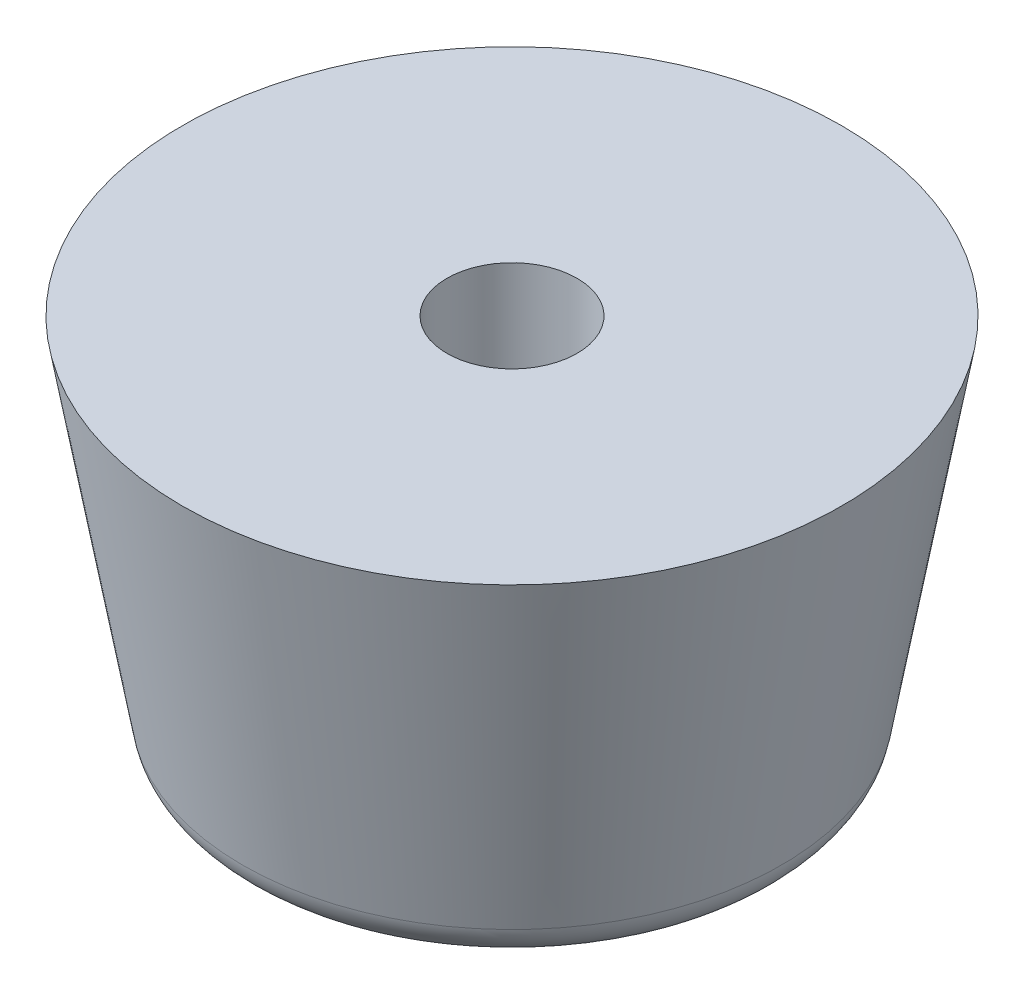
ISO-10303-21;
HEADER;
FILE_DESCRIPTION(('STEP AP214'),'2;1');
FILE_NAME('part.step','',(''),(''),'','','');
FILE_SCHEMA(('AUTOMOTIVE_DESIGN { 1 0 10303 214 1 1 1 1 }'));
ENDSEC;
DATA;
#1=APPLICATION_CONTEXT('core data for automotive mechanical design processes');
#2=APPLICATION_PROTOCOL_DEFINITION('international standard','automotive_design',2000,#1);
#3=PRODUCT_CONTEXT('',#1,'mechanical');
#4=PRODUCT('Part','Part','',(#3));
#5=PRODUCT_RELATED_PRODUCT_CATEGORY('part','',(#4));
#6=PRODUCT_DEFINITION_FORMATION('','',#4);
#7=PRODUCT_DEFINITION_CONTEXT('part definition',#1,'design');
#8=PRODUCT_DEFINITION('design','',#6,#7);
#9=PRODUCT_DEFINITION_SHAPE('','',#8);
#10=(LENGTH_UNIT() NAMED_UNIT(*) SI_UNIT(.MILLI.,.METRE.));
#11=(NAMED_UNIT(*) PLANE_ANGLE_UNIT() SI_UNIT($,.RADIAN.));
#12=(NAMED_UNIT(*) SI_UNIT($,.STERADIAN.) SOLID_ANGLE_UNIT());
#13=UNCERTAINTY_MEASURE_WITH_UNIT(LENGTH_MEASURE(1.E-05),#10,'distance_accuracy_value','');
#14=(GEOMETRIC_REPRESENTATION_CONTEXT(3) GLOBAL_UNCERTAINTY_ASSIGNED_CONTEXT((#13)) GLOBAL_UNIT_ASSIGNED_CONTEXT((#10,
#11,#12)) REPRESENTATION_CONTEXT('',''));
#15=CARTESIAN_POINT('',(0.,0.,0.));
#16=DIRECTION('',(0.,0.,1.));
#17=DIRECTION('',(1.,0.,0.));
#18=AXIS2_PLACEMENT_3D('',#15,#16,#17);
#19=CARTESIAN_POINT('',(0.,0.,0.));
#20=DIRECTION('',(0.,1.,0.));
#21=DIRECTION('',(0.,0.,1.));
#22=AXIS2_PLACEMENT_3D('',#19,#20,#21);
#23=CONICAL_SURFACE('',#22,15.19,0.174532925199433);
#24=CARTESIAN_POINT('',(0.,-15.7172963553339,0.));
#25=DIRECTION('',(0.,1.,0.));
#26=DIRECTION('',(0.,0.,1.));
#27=AXIS2_PLACEMENT_3D('',#24,#25,#26);
#28=CIRCLE('',#27,12.4186165887638);
#29=CARTESIAN_POINT('',(0.,-15.7172963553339,12.4186165887638));
#30=VERTEX_POINT('',#29);
#31=EDGE_CURVE('E40',#30,#30,#28,.T.);
#32=ORIENTED_EDGE('',*,*,#31,.T.);
#33=EDGE_LOOP('',(#32));
#34=FACE_BOUND('',#33,.T.);
#35=CARTESIAN_POINT('',(0.,0.,0.));
#36=DIRECTION('',(0.,1.,0.));
#37=DIRECTION('',(0.,0.,1.));
#38=AXIS2_PLACEMENT_3D('',#35,#36,#37);
#39=CIRCLE('',#38,15.19);
#40=CARTESIAN_POINT('',(0.,0.,15.19));
#41=VERTEX_POINT('',#40);
#42=EDGE_CURVE('E44',#41,#41,#39,.T.);
#43=ORIENTED_EDGE('',*,*,#42,.F.);
#44=EDGE_LOOP('',(#43));
#45=FACE_BOUND('',#44,.T.);
#46=ADVANCED_FACE('F33',(#34,#45),#23,.T.);
#47=CARTESIAN_POINT('',(0.,-17.37,0.));
#48=DIRECTION('',(0.,1.,0.));
#49=DIRECTION('',(0.,0.,1.));
#50=AXIS2_PLACEMENT_3D('',#47,#48,#49);
#51=PLANE('',#50);
#52=CARTESIAN_POINT('',(0.,-17.37,0.));
#53=DIRECTION('',(0.,1.,0.));
#54=DIRECTION('',(0.,0.,1.));
#55=AXIS2_PLACEMENT_3D('',#52,#53,#54);
#56=CIRCLE('',#55,10.4490010827394);
#57=CARTESIAN_POINT('',(0.,-17.37,10.4490010827394));
#58=VERTEX_POINT('',#57);
#59=EDGE_CURVE('E10',#58,#58,#56,.F.);
#60=ORIENTED_EDGE('',*,*,#59,.T.);
#61=EDGE_LOOP('',(#60));
#62=FACE_BOUND('',#61,.T.);
#63=CARTESIAN_POINT('',(0.,-17.37,0.));
#64=DIRECTION('',(0.,-1.,0.));
#65=DIRECTION('',(0.,0.,-1.));
#66=AXIS2_PLACEMENT_3D('',#63,#64,#65);
#67=CIRCLE('',#66,5.);
#68=CARTESIAN_POINT('',(0.,-17.37,-5.));
#69=VERTEX_POINT('',#68);
#70=EDGE_CURVE('E51',#69,#69,#67,.T.);
#71=ORIENTED_EDGE('',*,*,#70,.F.);
#72=EDGE_LOOP('',(#71));
#73=FACE_BOUND('',#72,.T.);
#74=ADVANCED_FACE('F84',(#62,#73),#51,.F.);
#75=CARTESIAN_POINT('',(0.,0.,0.));
#76=DIRECTION('',(0.,1.,0.));
#77=DIRECTION('',(0.,0.,1.));
#78=AXIS2_PLACEMENT_3D('',#75,#76,#77);
#79=PLANE('',#78);
#80=CARTESIAN_POINT('',(0.,0.,0.));
#81=DIRECTION('',(0.,-1.,0.));
#82=DIRECTION('',(0.,0.,-1.));
#83=AXIS2_PLACEMENT_3D('',#80,#81,#82);
#84=CIRCLE('',#83,3.);
#85=CARTESIAN_POINT('',(0.,0.,-3.));
#86=VERTEX_POINT('',#85);
#87=EDGE_CURVE('E54',#86,#86,#84,.T.);
#88=ORIENTED_EDGE('',*,*,#87,.T.);
#89=EDGE_LOOP('',(#88));
#90=FACE_BOUND('',#89,.T.);
#91=ORIENTED_EDGE('',*,*,#42,.T.);
#92=EDGE_LOOP('',(#91));
#93=FACE_BOUND('',#92,.T.);
#94=ADVANCED_FACE('F63',(#90,#93),#79,.T.);
#95=CARTESIAN_POINT('',(0.,-10.37,0.));
#96=DIRECTION('',(0.,-1.,0.));
#97=DIRECTION('',(0.,0.,-1.));
#98=AXIS2_PLACEMENT_3D('',#95,#96,#97);
#99=CYLINDRICAL_SURFACE('',#98,5.);
#100=CARTESIAN_POINT('',(0.,-10.37,0.));
#101=DIRECTION('',(0.,-1.,0.));
#102=DIRECTION('',(0.,0.,-1.));
#103=AXIS2_PLACEMENT_3D('',#100,#101,#102);
#104=CIRCLE('',#103,5.);
#105=CARTESIAN_POINT('',(0.,-10.37,-5.));
#106=VERTEX_POINT('',#105);
#107=EDGE_CURVE('E48',#106,#106,#104,.T.);
#108=ORIENTED_EDGE('',*,*,#107,.F.);
#109=EDGE_LOOP('',(#108));
#110=FACE_BOUND('',#109,.T.);
#111=ORIENTED_EDGE('',*,*,#70,.T.);
#112=EDGE_LOOP('',(#111));
#113=FACE_BOUND('',#112,.T.);
#114=ADVANCED_FACE('F75',(#110,#113),#99,.F.);
#115=CARTESIAN_POINT('',(0.,-10.37,0.));
#116=DIRECTION('',(0.,-1.,0.));
#117=DIRECTION('',(0.,0.,-1.));
#118=AXIS2_PLACEMENT_3D('',#115,#116,#117);
#119=PLANE('',#118);
#120=CARTESIAN_POINT('',(0.,-10.37,0.));
#121=DIRECTION('',(0.,-1.,0.));
#122=DIRECTION('',(0.,0.,-1.));
#123=AXIS2_PLACEMENT_3D('',#120,#121,#122);
#124=CIRCLE('',#123,3.);
#125=CARTESIAN_POINT('',(0.,-10.37,-3.));
#126=VERTEX_POINT('',#125);
#127=EDGE_CURVE('E57',#126,#126,#124,.T.);
#128=ORIENTED_EDGE('',*,*,#127,.F.);
#129=EDGE_LOOP('',(#128));
#130=FACE_BOUND('',#129,.T.);
#131=ORIENTED_EDGE('',*,*,#107,.T.);
#132=EDGE_LOOP('',(#131));
#133=FACE_BOUND('',#132,.T.);
#134=ADVANCED_FACE('F69',(#130,#133),#119,.T.);
#135=CARTESIAN_POINT('',(0.,0.,0.));
#136=DIRECTION('',(0.,-1.,0.));
#137=DIRECTION('',(0.,0.,-1.));
#138=AXIS2_PLACEMENT_3D('',#135,#136,#137);
#139=CYLINDRICAL_SURFACE('',#138,3.);
#140=ORIENTED_EDGE('',*,*,#87,.F.);
#141=EDGE_LOOP('',(#140));
#142=FACE_BOUND('',#141,.T.);
#143=ORIENTED_EDGE('',*,*,#127,.T.);
#144=EDGE_LOOP('',(#143));
#145=FACE_BOUND('',#144,.T.);
#146=ADVANCED_FACE('F66',(#142,#145),#139,.F.);
#147=CARTESIAN_POINT('',(0.,-15.37,0.));
#148=DIRECTION('',(0.,1.,0.));
#149=DIRECTION('',(0.,0.,1.));
#150=AXIS2_PLACEMENT_3D('',#147,#148,#149);
#151=TOROIDAL_SURFACE('',#150,10.4490010827394,2.);
#152=ORIENTED_EDGE('',*,*,#59,.F.);
#153=EDGE_LOOP('',(#152));
#154=FACE_BOUND('',#153,.T.);
#155=ORIENTED_EDGE('',*,*,#31,.F.);
#156=EDGE_LOOP('',(#155));
#157=FACE_BOUND('',#156,.T.);
#158=ADVANCED_FACE('F35',(#154,#157),#151,.T.);
#159=CLOSED_SHELL('',(#46,#74,#94,#114,#134,#146,#158));
#160=MANIFOLD_SOLID_BREP('B2',#159);
#161=ADVANCED_BREP_SHAPE_REPRESENTATION('',(#18,#160),#14);
#162=SHAPE_DEFINITION_REPRESENTATION(#9,#161);
ENDSEC;
END-ISO-10303-21;
